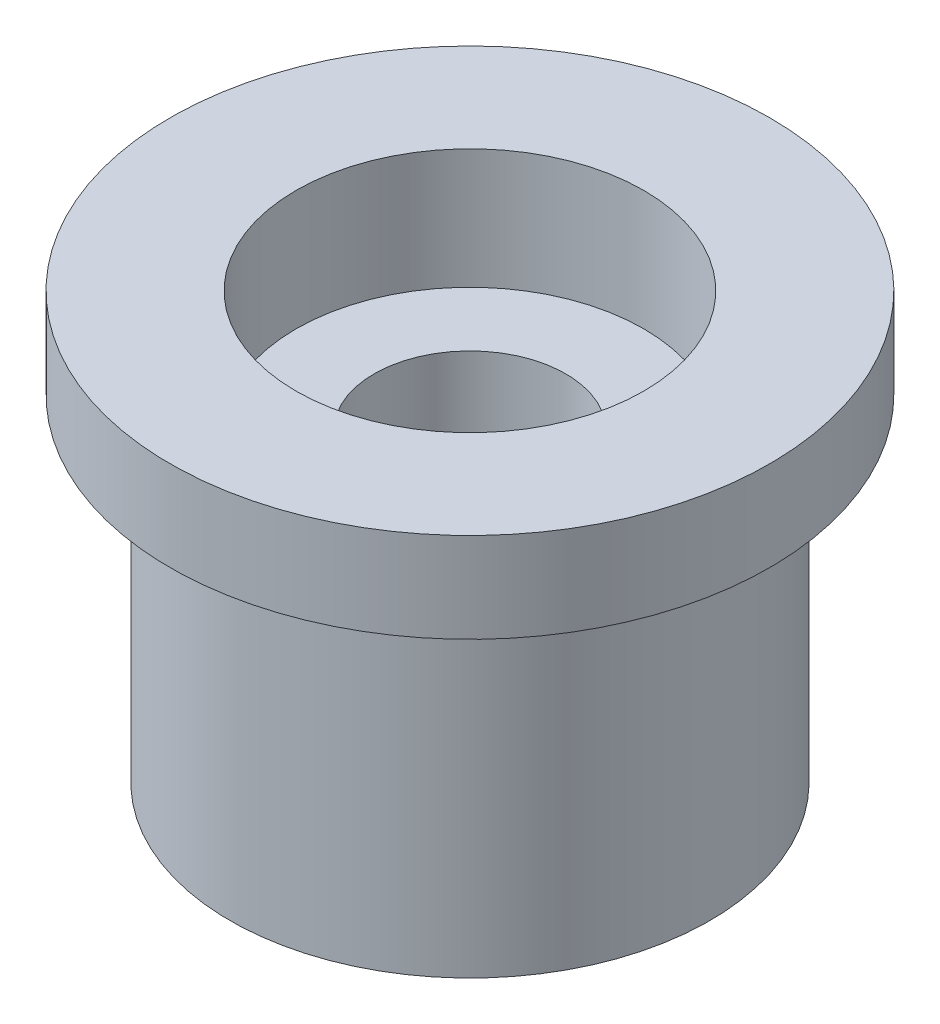
ISO-10303-21;
HEADER;
FILE_DESCRIPTION(('STEP AP214'),'2;1');
FILE_NAME('part.step','',(''),(''),'','','');
FILE_SCHEMA(('AUTOMOTIVE_DESIGN { 1 0 10303 214 1 1 1 1 }'));
ENDSEC;
DATA;
#1=APPLICATION_CONTEXT('core data for automotive mechanical design processes');
#2=APPLICATION_PROTOCOL_DEFINITION('international standard','automotive_design',2000,#1);
#3=PRODUCT_CONTEXT('',#1,'mechanical');
#4=PRODUCT('Part','Part','',(#3));
#5=PRODUCT_RELATED_PRODUCT_CATEGORY('part','',(#4));
#6=PRODUCT_DEFINITION_FORMATION('','',#4);
#7=PRODUCT_DEFINITION_CONTEXT('part definition',#1,'design');
#8=PRODUCT_DEFINITION('design','',#6,#7);
#9=PRODUCT_DEFINITION_SHAPE('','',#8);
#10=(LENGTH_UNIT() NAMED_UNIT(*) SI_UNIT(.MILLI.,.METRE.));
#11=(NAMED_UNIT(*) PLANE_ANGLE_UNIT() SI_UNIT($,.RADIAN.));
#12=(NAMED_UNIT(*) SI_UNIT($,.STERADIAN.) SOLID_ANGLE_UNIT());
#13=UNCERTAINTY_MEASURE_WITH_UNIT(LENGTH_MEASURE(1.E-05),#10,'distance_accuracy_value','');
#14=(GEOMETRIC_REPRESENTATION_CONTEXT(3) GLOBAL_UNCERTAINTY_ASSIGNED_CONTEXT((#13)) GLOBAL_UNIT_ASSIGNED_CONTEXT((#10,
#11,#12)) REPRESENTATION_CONTEXT('',''));
#15=CARTESIAN_POINT('',(0.,0.,0.));
#16=DIRECTION('',(0.,0.,1.));
#17=DIRECTION('',(1.,0.,0.));
#18=AXIS2_PLACEMENT_3D('',#15,#16,#17);
#19=CARTESIAN_POINT('',(0.,7.1,0.));
#20=DIRECTION('',(0.,-1.,0.));
#21=DIRECTION('',(0.,0.,-1.));
#22=AXIS2_PLACEMENT_3D('',#19,#20,#21);
#23=CYLINDRICAL_SURFACE('',#22,5.);
#24=CARTESIAN_POINT('',(0.,7.1,0.));
#25=DIRECTION('',(0.,-1.,0.));
#26=DIRECTION('',(0.,0.,-1.));
#27=AXIS2_PLACEMENT_3D('',#24,#25,#26);
#28=CIRCLE('',#27,5.);
#29=CARTESIAN_POINT('',(0.,7.1,-5.));
#30=VERTEX_POINT('',#29);
#31=EDGE_CURVE('E11',#30,#30,#28,.T.);
#32=ORIENTED_EDGE('',*,*,#31,.T.);
#33=EDGE_LOOP('',(#32));
#34=FACE_BOUND('',#33,.T.);
#35=CARTESIAN_POINT('',(0.,5.6,0.));
#36=DIRECTION('',(0.,-1.,0.));
#37=DIRECTION('',(0.,0.,-1.));
#38=AXIS2_PLACEMENT_3D('',#35,#36,#37);
#39=CIRCLE('',#38,5.);
#40=CARTESIAN_POINT('',(0.,5.6,-5.));
#41=VERTEX_POINT('',#40);
#42=EDGE_CURVE('E40',#41,#41,#39,.T.);
#43=ORIENTED_EDGE('',*,*,#42,.F.);
#44=EDGE_LOOP('',(#43));
#45=FACE_BOUND('',#44,.T.);
#46=ADVANCED_FACE('F33',(#34,#45),#23,.T.);
#47=CARTESIAN_POINT('',(5.,7.1,0.));
#48=DIRECTION('',(0.,1.,0.));
#49=DIRECTION('',(0.,0.,1.));
#50=AXIS2_PLACEMENT_3D('',#47,#48,#49);
#51=PLANE('',#50);
#52=CARTESIAN_POINT('',(0.,7.1,0.));
#53=DIRECTION('',(0.,1.,0.));
#54=DIRECTION('',(0.,0.,1.));
#55=AXIS2_PLACEMENT_3D('',#52,#53,#54);
#56=CIRCLE('',#55,2.9);
#57=CARTESIAN_POINT('',(0.,7.1,2.9));
#58=VERTEX_POINT('',#57);
#59=EDGE_CURVE('E329',#58,#58,#56,.T.);
#60=ORIENTED_EDGE('',*,*,#59,.F.);
#61=EDGE_LOOP('',(#60));
#62=FACE_BOUND('',#61,.T.);
#63=ORIENTED_EDGE('',*,*,#31,.F.);
#64=EDGE_LOOP('',(#63));
#65=FACE_BOUND('',#64,.T.);
#66=ADVANCED_FACE('F235',(#62,#65),#51,.T.);
#67=CARTESIAN_POINT('',(0.,5.6,0.));
#68=DIRECTION('',(0.,-1.,0.));
#69=DIRECTION('',(0.,0.,-1.));
#70=AXIS2_PLACEMENT_3D('',#67,#68,#69);
#71=PLANE('',#70);
#72=CARTESIAN_POINT('',(0.,5.6,0.));
#73=DIRECTION('',(0.,-1.,0.));
#74=DIRECTION('',(0.,0.,-1.));
#75=AXIS2_PLACEMENT_3D('',#72,#73,#74);
#76=CIRCLE('',#75,4.);
#77=CARTESIAN_POINT('',(0.,5.6,-4.));
#78=VERTEX_POINT('',#77);
#79=EDGE_CURVE('E218',#78,#78,#76,.T.);
#80=ORIENTED_EDGE('',*,*,#79,.F.);
#81=EDGE_LOOP('',(#80));
#82=FACE_BOUND('',#81,.T.);
#83=ORIENTED_EDGE('',*,*,#42,.T.);
#84=EDGE_LOOP('',(#83));
#85=FACE_BOUND('',#84,.T.);
#86=ADVANCED_FACE('F232',(#82,#85),#71,.T.);
#87=CARTESIAN_POINT('',(0.,0.,0.));
#88=DIRECTION('',(0.,1.,0.));
#89=DIRECTION('',(0.,0.,1.));
#90=AXIS2_PLACEMENT_3D('',#87,#88,#89);
#91=CYLINDRICAL_SURFACE('',#90,4.);
#92=CARTESIAN_POINT('',(0.,0.,0.));
#93=DIRECTION('',(0.,-1.,0.));
#94=DIRECTION('',(0.,0.,-1.));
#95=AXIS2_PLACEMENT_3D('',#92,#93,#94);
#96=CIRCLE('',#95,4.);
#97=CARTESIAN_POINT('',(0.,0.,-4.));
#98=VERTEX_POINT('',#97);
#99=EDGE_CURVE('E225',#98,#98,#96,.T.);
#100=ORIENTED_EDGE('',*,*,#99,.F.);
#101=EDGE_LOOP('',(#100));
#102=FACE_BOUND('',#101,.T.);
#103=ORIENTED_EDGE('',*,*,#79,.T.);
#104=EDGE_LOOP('',(#103));
#105=FACE_BOUND('',#104,.T.);
#106=ADVANCED_FACE('F246',(#102,#105),#91,.T.);
#107=CARTESIAN_POINT('',(0.,0.,0.));
#108=DIRECTION('',(0.,-1.,0.));
#109=DIRECTION('',(0.,0.,-1.));
#110=AXIS2_PLACEMENT_3D('',#107,#108,#109);
#111=PLANE('',#110);
#112=CARTESIAN_POINT('',(0.,0.,0.));
#113=DIRECTION('',(0.,1.,0.));
#114=DIRECTION('',(0.,0.,1.));
#115=AXIS2_PLACEMENT_3D('',#112,#113,#114);
#116=CIRCLE('',#115,1.60000000000001);
#117=CARTESIAN_POINT('',(0.,0.,1.60000000000001));
#118=VERTEX_POINT('',#117);
#119=EDGE_CURVE('E147',#118,#118,#116,.T.);
#120=ORIENTED_EDGE('',*,*,#119,.T.);
#121=EDGE_LOOP('',(#120));
#122=FACE_BOUND('',#121,.T.);
#123=CARTESIAN_POINT('',(-1.02515075142256E-13,0.,0.));
#124=DIRECTION('',(0.,-1.,0.));
#125=DIRECTION('',(0.,0.,-1.));
#126=AXIS2_PLACEMENT_3D('',#123,#124,#125);
#127=CIRCLE('',#126,3.09999999999998);
#128=CARTESIAN_POINT('',(-1.88345277640779,0.,2.46223590239489));
#129=VERTEX_POINT('',#128);
#130=CARTESIAN_POINT('',(-1.88345277640771,0.,-2.46223590239483));
#131=VERTEX_POINT('',#130);
#132=EDGE_CURVE('E47',#129,#131,#127,.T.);
#133=ORIENTED_EDGE('',*,*,#132,.F.);
#134=DIRECTION('',(-0.500000000000124,0.,0.866025403784367));
#135=VECTOR('',#134,1.);
#136=CARTESIAN_POINT('',(-1.47888532680438,0.,1.76150452459345));
#137=LINE('',#136,#135);
#138=CARTESIAN_POINT('',(-1.47888532680438,0.,1.76150452459345));
#139=VERTEX_POINT('',#138);
#140=EDGE_CURVE('E141',#139,#129,#137,.T.);
#141=ORIENTED_EDGE('',*,*,#140,.F.);
#142=CARTESIAN_POINT('',(-1.02515075142256E-13,0.,0.));
#143=DIRECTION('',(0.,1.,0.));
#144=DIRECTION('',(0.,0.,1.));
#145=AXIS2_PLACEMENT_3D('',#142,#143,#144);
#146=CIRCLE('',#145,2.3);
#147=CARTESIAN_POINT('',(-1.4788853268044,0.,-1.76150452459332));
#148=VERTEX_POINT('',#147);
#149=EDGE_CURVE('E144',#148,#139,#146,.T.);
#150=ORIENTED_EDGE('',*,*,#149,.F.);
#151=DIRECTION('',(0.5,0.,0.866025403784439));
#152=VECTOR('',#151,1.);
#153=CARTESIAN_POINT('',(-1.88345277640771,0.,-2.46223590239483));
#154=LINE('',#153,#152);
#155=EDGE_CURVE('E153',#131,#148,#154,.T.);
#156=ORIENTED_EDGE('',*,*,#155,.F.);
#157=EDGE_LOOP('',(#133,#141,#150,#156));
#158=FACE_BOUND('',#157,.T.);
#159=CARTESIAN_POINT('',(0.,0.,0.));
#160=DIRECTION('',(0.,1.,0.));
#161=DIRECTION('',(0.,0.,1.));
#162=AXIS2_PLACEMENT_3D('',#159,#160,#161);
#163=CIRCLE('',#162,2.3);
#164=CARTESIAN_POINT('',(2.26495033058122,0.,-0.400000000000019));
#165=VERTEX_POINT('',#164);
#166=CARTESIAN_POINT('',(-0.786065003776926,0.,-2.16150452459327));
#167=VERTEX_POINT('',#166);
#168=EDGE_CURVE('E55',#165,#167,#163,.T.);
#169=ORIENTED_EDGE('',*,*,#168,.F.);
#170=DIRECTION('',(-1.,0.,0.));
#171=VECTOR('',#170,1.);
#172=CARTESIAN_POINT('',(3.07408522978788,0.,-0.399999999999992));
#173=LINE('',#172,#171);
#174=CARTESIAN_POINT('',(3.07408522978788,0.,-0.399999999999993));
#175=VERTEX_POINT('',#174);
#176=EDGE_CURVE('E166',#175,#165,#173,.T.);
#177=ORIENTED_EDGE('',*,*,#176,.F.);
#178=CARTESIAN_POINT('',(0.,0.,0.));
#179=DIRECTION('',(0.,-1.,0.));
#180=DIRECTION('',(0.,0.,-1.));
#181=AXIS2_PLACEMENT_3D('',#178,#179,#180);
#182=CIRCLE('',#181,3.1);
#183=CARTESIAN_POINT('',(-1.19063245338013,0.,-2.86223590239484));
#184=VERTEX_POINT('',#183);
#185=EDGE_CURVE('E180',#184,#175,#182,.T.);
#186=ORIENTED_EDGE('',*,*,#185,.F.);
#187=DIRECTION('',(-0.499999999999857,0.,-0.866025403784521));
#188=VECTOR('',#187,1.);
#189=CARTESIAN_POINT('',(-0.786065003776927,0.,-2.16150452459327));
#190=LINE('',#189,#188);
#191=EDGE_CURVE('E177',#167,#184,#190,.T.);
#192=ORIENTED_EDGE('',*,*,#191,.F.);
#193=EDGE_LOOP('',(#169,#177,#186,#192));
#194=FACE_BOUND('',#193,.T.);
#195=CARTESIAN_POINT('',(0.,0.,0.));
#196=DIRECTION('',(0.,-1.,0.));
#197=DIRECTION('',(0.,0.,-1.));
#198=AXIS2_PLACEMENT_3D('',#195,#196,#197);
#199=CIRCLE('',#198,3.1);
#200=CARTESIAN_POINT('',(3.07408522978788,0.,0.399999999999992));
#201=VERTEX_POINT('',#200);
#202=CARTESIAN_POINT('',(-1.19063245337983,0.,2.86223590239497));
#203=VERTEX_POINT('',#202);
#204=EDGE_CURVE('E187',#201,#203,#199,.T.);
#205=ORIENTED_EDGE('',*,*,#204,.F.);
#206=DIRECTION('',(1.,0.,0.));
#207=VECTOR('',#206,1.);
#208=CARTESIAN_POINT('',(2.26495033058122,0.,0.400000000000019));
#209=LINE('',#208,#207);
#210=CARTESIAN_POINT('',(2.26495033058122,0.,0.40000000000002));
#211=VERTEX_POINT('',#210);
#212=EDGE_CURVE('E197',#211,#201,#209,.T.);
#213=ORIENTED_EDGE('',*,*,#212,.F.);
#214=CARTESIAN_POINT('',(0.,0.,0.));
#215=DIRECTION('',(0.,1.,0.));
#216=DIRECTION('',(0.,0.,1.));
#217=AXIS2_PLACEMENT_3D('',#214,#215,#216);
#218=CIRCLE('',#217,2.3);
#219=CARTESIAN_POINT('',(-0.786065003776618,0.,2.16150452459338));
#220=VERTEX_POINT('',#219);
#221=EDGE_CURVE('E211',#220,#211,#218,.T.);
#222=ORIENTED_EDGE('',*,*,#221,.F.);
#223=DIRECTION('',(0.499999999999856,0.,-0.866025403784522));
#224=VECTOR('',#223,1.);
#225=CARTESIAN_POINT('',(-1.19063245337983,0.,2.86223590239497));
#226=LINE('',#225,#224);
#227=EDGE_CURVE('E208',#203,#220,#226,.T.);
#228=ORIENTED_EDGE('',*,*,#227,.F.);
#229=EDGE_LOOP('',(#205,#213,#222,#228));
#230=FACE_BOUND('',#229,.T.);
#231=ORIENTED_EDGE('',*,*,#99,.T.);
#232=EDGE_LOOP('',(#231));
#233=FACE_BOUND('',#232,.T.);
#234=ADVANCED_FACE('F253',(#122,#158,#194,#230,#233),#111,.T.);
#235=CARTESIAN_POINT('',(0.,4.3,0.));
#236=DIRECTION('',(0.,-1.,0.));
#237=DIRECTION('',(0.,0.,-1.));
#238=AXIS2_PLACEMENT_3D('',#235,#236,#237);
#239=CYLINDRICAL_SURFACE('',#238,3.1);
#240=ORIENTED_EDGE('',*,*,#204,.T.);
#241=DIRECTION('',(0.,-1.,0.));
#242=VECTOR('',#241,1.);
#243=CARTESIAN_POINT('',(-1.19063245337983,4.3,2.86223590239497));
#244=LINE('',#243,#242);
#245=CARTESIAN_POINT('',(-1.19063245337983,4.3,2.86223590239497));
#246=VERTEX_POINT('',#245);
#247=EDGE_CURVE('E206',#246,#203,#244,.T.);
#248=ORIENTED_EDGE('',*,*,#247,.F.);
#249=CARTESIAN_POINT('',(0.,4.3,0.));
#250=DIRECTION('',(0.,-1.,0.));
#251=DIRECTION('',(0.,0.,-1.));
#252=AXIS2_PLACEMENT_3D('',#249,#250,#251);
#253=CIRCLE('',#252,3.1);
#254=CARTESIAN_POINT('',(3.07408522978788,4.3,0.399999999999992));
#255=VERTEX_POINT('',#254);
#256=EDGE_CURVE('E193',#255,#246,#253,.T.);
#257=ORIENTED_EDGE('',*,*,#256,.F.);
#258=DIRECTION('',(0.,-1.,0.));
#259=VECTOR('',#258,1.);
#260=CARTESIAN_POINT('',(3.07408522978788,4.3,0.399999999999992));
#261=LINE('',#260,#259);
#262=EDGE_CURVE('E216',#255,#201,#261,.T.);
#263=ORIENTED_EDGE('',*,*,#262,.T.);
#264=EDGE_LOOP('',(#240,#248,#257,#263));
#265=FACE_BOUND('',#264,.T.);
#266=ADVANCED_FACE('F257',(#265),#239,.F.);
#267=CARTESIAN_POINT('',(2.26495033058122,4.3,0.400000000000019));
#268=DIRECTION('',(0.,0.,-1.));
#269=DIRECTION('',(-1.,0.,0.));
#270=AXIS2_PLACEMENT_3D('',#267,#268,#269);
#271=PLANE('',#270);
#272=ORIENTED_EDGE('',*,*,#212,.T.);
#273=ORIENTED_EDGE('',*,*,#262,.F.);
#274=DIRECTION('',(1.,0.,0.));
#275=VECTOR('',#274,1.);
#276=CARTESIAN_POINT('',(2.26495033058122,4.3,0.400000000000019));
#277=LINE('',#276,#275);
#278=CARTESIAN_POINT('',(2.26495033058122,4.3,0.40000000000002));
#279=VERTEX_POINT('',#278);
#280=EDGE_CURVE('E203',#279,#255,#277,.T.);
#281=ORIENTED_EDGE('',*,*,#280,.F.);
#282=DIRECTION('',(0.,-1.,0.));
#283=VECTOR('',#282,1.);
#284=CARTESIAN_POINT('',(2.26495033058122,4.3,0.40000000000002));
#285=LINE('',#284,#283);
#286=EDGE_CURVE('E219',#279,#211,#285,.T.);
#287=ORIENTED_EDGE('',*,*,#286,.T.);
#288=EDGE_LOOP('',(#272,#273,#281,#287));
#289=FACE_BOUND('',#288,.T.);
#290=ADVANCED_FACE('F261',(#289),#271,.F.);
#291=CARTESIAN_POINT('',(0.,4.3,0.));
#292=DIRECTION('',(0.,-1.,0.));
#293=DIRECTION('',(0.,0.,-1.));
#294=AXIS2_PLACEMENT_3D('',#291,#292,#293);
#295=CYLINDRICAL_SURFACE('',#294,2.3);
#296=ORIENTED_EDGE('',*,*,#221,.T.);
#297=ORIENTED_EDGE('',*,*,#286,.F.);
#298=CARTESIAN_POINT('',(0.,4.3,0.));
#299=DIRECTION('',(0.,1.,0.));
#300=DIRECTION('',(0.,0.,1.));
#301=AXIS2_PLACEMENT_3D('',#298,#299,#300);
#302=CIRCLE('',#301,2.3);
#303=CARTESIAN_POINT('',(-0.786065003776618,4.3,2.16150452459338));
#304=VERTEX_POINT('',#303);
#305=EDGE_CURVE('E200',#304,#279,#302,.T.);
#306=ORIENTED_EDGE('',*,*,#305,.F.);
#307=DIRECTION('',(0.,-1.,0.));
#308=VECTOR('',#307,1.);
#309=CARTESIAN_POINT('',(-0.786065003776618,4.3,2.16150452459338));
#310=LINE('',#309,#308);
#311=EDGE_CURVE('E221',#304,#220,#310,.T.);
#312=ORIENTED_EDGE('',*,*,#311,.T.);
#313=EDGE_LOOP('',(#296,#297,#306,#312));
#314=FACE_BOUND('',#313,.T.);
#315=ADVANCED_FACE('F267',(#314),#295,.T.);
#316=CARTESIAN_POINT('',(-1.19063245337983,4.3,2.86223590239497));
#317=DIRECTION('',(-0.866025403784522,0.,-0.499999999999856));
#318=DIRECTION('',(-0.499999999999856,0.,0.866025403784522));
#319=AXIS2_PLACEMENT_3D('',#316,#317,#318);
#320=PLANE('',#319);
#321=ORIENTED_EDGE('',*,*,#227,.T.);
#322=ORIENTED_EDGE('',*,*,#311,.F.);
#323=DIRECTION('',(0.499999999999856,0.,-0.866025403784522));
#324=VECTOR('',#323,1.);
#325=CARTESIAN_POINT('',(-1.19063245337983,4.3,2.86223590239497));
#326=LINE('',#325,#324);
#327=EDGE_CURVE('E196',#246,#304,#326,.T.);
#328=ORIENTED_EDGE('',*,*,#327,.F.);
#329=ORIENTED_EDGE('',*,*,#247,.T.);
#330=EDGE_LOOP('',(#321,#322,#328,#329));
#331=FACE_BOUND('',#330,.T.);
#332=ADVANCED_FACE('F263',(#331),#320,.F.);
#333=CARTESIAN_POINT('',(0.,4.3,0.));
#334=DIRECTION('',(0.,-1.,0.));
#335=DIRECTION('',(0.,0.,-1.));
#336=AXIS2_PLACEMENT_3D('',#333,#334,#335);
#337=PLANE('',#336);
#338=ORIENTED_EDGE('',*,*,#256,.T.);
#339=ORIENTED_EDGE('',*,*,#327,.T.);
#340=ORIENTED_EDGE('',*,*,#305,.T.);
#341=ORIENTED_EDGE('',*,*,#280,.T.);
#342=EDGE_LOOP('',(#338,#339,#340,#341));
#343=FACE_BOUND('',#342,.T.);
#344=ADVANCED_FACE('F266',(#343),#337,.T.);
#345=CARTESIAN_POINT('',(0.,4.3,0.));
#346=DIRECTION('',(0.,-1.,0.));
#347=DIRECTION('',(0.,0.,-1.));
#348=AXIS2_PLACEMENT_3D('',#345,#346,#347);
#349=CYLINDRICAL_SURFACE('',#348,2.3);
#350=ORIENTED_EDGE('',*,*,#168,.T.);
#351=DIRECTION('',(0.,-1.,0.));
#352=VECTOR('',#351,1.);
#353=CARTESIAN_POINT('',(-0.786065003776927,4.3,-2.16150452459327));
#354=LINE('',#353,#352);
#355=CARTESIAN_POINT('',(-0.786065003776927,4.3,-2.16150452459327));
#356=VERTEX_POINT('',#355);
#357=EDGE_CURVE('E175',#356,#167,#354,.T.);
#358=ORIENTED_EDGE('',*,*,#357,.F.);
#359=CARTESIAN_POINT('',(0.,4.3,0.));
#360=DIRECTION('',(0.,1.,0.));
#361=DIRECTION('',(0.,0.,1.));
#362=AXIS2_PLACEMENT_3D('',#359,#360,#361);
#363=CIRCLE('',#362,2.3);
#364=CARTESIAN_POINT('',(2.26495033058122,4.3,-0.400000000000019));
#365=VERTEX_POINT('',#364);
#366=EDGE_CURVE('E162',#365,#356,#363,.T.);
#367=ORIENTED_EDGE('',*,*,#366,.F.);
#368=DIRECTION('',(0.,-1.,0.));
#369=VECTOR('',#368,1.);
#370=CARTESIAN_POINT('',(2.26495033058122,4.3,-0.400000000000019));
#371=LINE('',#370,#369);
#372=EDGE_CURVE('E185',#365,#165,#371,.T.);
#373=ORIENTED_EDGE('',*,*,#372,.T.);
#374=EDGE_LOOP('',(#350,#358,#367,#373));
#375=FACE_BOUND('',#374,.T.);
#376=ADVANCED_FACE('F277',(#375),#349,.T.);
#377=CARTESIAN_POINT('',(3.07408522978788,4.3,-0.399999999999992));
#378=DIRECTION('',(0.,0.,1.));
#379=DIRECTION('',(1.,0.,0.));
#380=AXIS2_PLACEMENT_3D('',#377,#378,#379);
#381=PLANE('',#380);
#382=ORIENTED_EDGE('',*,*,#176,.T.);
#383=ORIENTED_EDGE('',*,*,#372,.F.);
#384=DIRECTION('',(-1.,0.,0.));
#385=VECTOR('',#384,1.);
#386=CARTESIAN_POINT('',(3.07408522978788,4.3,-0.399999999999992));
#387=LINE('',#386,#385);
#388=CARTESIAN_POINT('',(3.07408522978788,4.3,-0.399999999999993));
#389=VERTEX_POINT('',#388);
#390=EDGE_CURVE('E172',#389,#365,#387,.T.);
#391=ORIENTED_EDGE('',*,*,#390,.F.);
#392=DIRECTION('',(0.,-1.,0.));
#393=VECTOR('',#392,1.);
#394=CARTESIAN_POINT('',(3.07408522978788,4.3,-0.399999999999993));
#395=LINE('',#394,#393);
#396=EDGE_CURVE('E188',#389,#175,#395,.T.);
#397=ORIENTED_EDGE('',*,*,#396,.T.);
#398=EDGE_LOOP('',(#382,#383,#391,#397));
#399=FACE_BOUND('',#398,.T.);
#400=ADVANCED_FACE('F281',(#399),#381,.F.);
#401=CARTESIAN_POINT('',(0.,4.3,0.));
#402=DIRECTION('',(0.,-1.,0.));
#403=DIRECTION('',(0.,0.,-1.));
#404=AXIS2_PLACEMENT_3D('',#401,#402,#403);
#405=CYLINDRICAL_SURFACE('',#404,3.1);
#406=ORIENTED_EDGE('',*,*,#185,.T.);
#407=ORIENTED_EDGE('',*,*,#396,.F.);
#408=CARTESIAN_POINT('',(0.,4.3,0.));
#409=DIRECTION('',(0.,-1.,0.));
#410=DIRECTION('',(0.,0.,-1.));
#411=AXIS2_PLACEMENT_3D('',#408,#409,#410);
#412=CIRCLE('',#411,3.1);
#413=CARTESIAN_POINT('',(-1.19063245338013,4.3,-2.86223590239484));
#414=VERTEX_POINT('',#413);
#415=EDGE_CURVE('E169',#414,#389,#412,.T.);
#416=ORIENTED_EDGE('',*,*,#415,.F.);
#417=DIRECTION('',(0.,-1.,0.));
#418=VECTOR('',#417,1.);
#419=CARTESIAN_POINT('',(-1.19063245338013,4.3,-2.86223590239484));
#420=LINE('',#419,#418);
#421=EDGE_CURVE('E190',#414,#184,#420,.T.);
#422=ORIENTED_EDGE('',*,*,#421,.T.);
#423=EDGE_LOOP('',(#406,#407,#416,#422));
#424=FACE_BOUND('',#423,.T.);
#425=ADVANCED_FACE('F286',(#424),#405,.F.);
#426=CARTESIAN_POINT('',(-0.786065003776927,4.3,-2.16150452459327));
#427=DIRECTION('',(-0.866025403784521,0.,0.499999999999857));
#428=DIRECTION('',(0.499999999999857,0.,0.866025403784521));
#429=AXIS2_PLACEMENT_3D('',#426,#427,#428);
#430=PLANE('',#429);
#431=ORIENTED_EDGE('',*,*,#191,.T.);
#432=ORIENTED_EDGE('',*,*,#421,.F.);
#433=DIRECTION('',(-0.499999999999857,0.,-0.866025403784521));
#434=VECTOR('',#433,1.);
#435=CARTESIAN_POINT('',(-0.786065003776927,4.3,-2.16150452459327));
#436=LINE('',#435,#434);
#437=EDGE_CURVE('E165',#356,#414,#436,.T.);
#438=ORIENTED_EDGE('',*,*,#437,.F.);
#439=ORIENTED_EDGE('',*,*,#357,.T.);
#440=EDGE_LOOP('',(#431,#432,#438,#439));
#441=FACE_BOUND('',#440,.T.);
#442=ADVANCED_FACE('F282',(#441),#430,.F.);
#443=CARTESIAN_POINT('',(0.,4.3,0.));
#444=DIRECTION('',(0.,1.,0.));
#445=DIRECTION('',(0.,0.,1.));
#446=AXIS2_PLACEMENT_3D('',#443,#444,#445);
#447=PLANE('',#446);
#448=ORIENTED_EDGE('',*,*,#366,.T.);
#449=ORIENTED_EDGE('',*,*,#437,.T.);
#450=ORIENTED_EDGE('',*,*,#415,.T.);
#451=ORIENTED_EDGE('',*,*,#390,.T.);
#452=EDGE_LOOP('',(#448,#449,#450,#451));
#453=FACE_BOUND('',#452,.T.);
#454=ADVANCED_FACE('F285',(#453),#447,.F.);
#455=CARTESIAN_POINT('',(-1.02515075142256E-13,4.3,0.));
#456=DIRECTION('',(0.,-1.,0.));
#457=DIRECTION('',(0.,0.,-1.));
#458=AXIS2_PLACEMENT_3D('',#455,#456,#457);
#459=CYLINDRICAL_SURFACE('',#458,3.09999999999998);
#460=ORIENTED_EDGE('',*,*,#132,.T.);
#461=DIRECTION('',(0.,-1.,0.));
#462=VECTOR('',#461,1.);
#463=CARTESIAN_POINT('',(-1.88345277640771,4.3,-2.46223590239483));
#464=LINE('',#463,#462);
#465=CARTESIAN_POINT('',(-1.88345277640771,4.3,-2.46223590239483));
#466=VERTEX_POINT('',#465);
#467=EDGE_CURVE('E119',#466,#131,#464,.T.);
#468=ORIENTED_EDGE('',*,*,#467,.F.);
#469=CARTESIAN_POINT('',(-1.02515075142256E-13,4.3,0.));
#470=DIRECTION('',(0.,-1.,0.));
#471=DIRECTION('',(0.,0.,-1.));
#472=AXIS2_PLACEMENT_3D('',#469,#470,#471);
#473=CIRCLE('',#472,3.09999999999998);
#474=CARTESIAN_POINT('',(-1.88345277640779,4.3,2.46223590239489));
#475=VERTEX_POINT('',#474);
#476=EDGE_CURVE('E123',#475,#466,#473,.T.);
#477=ORIENTED_EDGE('',*,*,#476,.F.);
#478=DIRECTION('',(0.,-1.,0.));
#479=VECTOR('',#478,1.);
#480=CARTESIAN_POINT('',(-1.88345277640779,4.3,2.46223590239489));
#481=LINE('',#480,#479);
#482=EDGE_CURVE('E157',#475,#129,#481,.T.);
#483=ORIENTED_EDGE('',*,*,#482,.T.);
#484=EDGE_LOOP('',(#460,#468,#477,#483));
#485=FACE_BOUND('',#484,.T.);
#486=ADVANCED_FACE('F121',(#485),#459,.F.);
#487=CARTESIAN_POINT('',(-1.47888532680438,4.3,1.76150452459345));
#488=DIRECTION('',(0.866025403784367,0.,0.500000000000124));
#489=DIRECTION('',(0.500000000000124,0.,-0.866025403784367));
#490=AXIS2_PLACEMENT_3D('',#487,#488,#489);
#491=PLANE('',#490);
#492=ORIENTED_EDGE('',*,*,#140,.T.);
#493=ORIENTED_EDGE('',*,*,#482,.F.);
#494=DIRECTION('',(-0.500000000000124,0.,0.866025403784367));
#495=VECTOR('',#494,1.);
#496=CARTESIAN_POINT('',(-1.47888532680438,4.3,1.76150452459345));
#497=LINE('',#496,#495);
#498=CARTESIAN_POINT('',(-1.47888532680438,4.3,1.76150452459345));
#499=VERTEX_POINT('',#498);
#500=EDGE_CURVE('E129',#499,#475,#497,.T.);
#501=ORIENTED_EDGE('',*,*,#500,.F.);
#502=DIRECTION('',(0.,-1.,0.));
#503=VECTOR('',#502,1.);
#504=CARTESIAN_POINT('',(-1.47888532680438,4.3,1.76150452459345));
#505=LINE('',#504,#503);
#506=EDGE_CURVE('E159',#499,#139,#505,.T.);
#507=ORIENTED_EDGE('',*,*,#506,.T.);
#508=EDGE_LOOP('',(#492,#493,#501,#507));
#509=FACE_BOUND('',#508,.T.);
#510=ADVANCED_FACE('F299',(#509),#491,.F.);
#511=CARTESIAN_POINT('',(-1.02515075142256E-13,4.3,0.));
#512=DIRECTION('',(0.,-1.,0.));
#513=DIRECTION('',(0.,0.,-1.));
#514=AXIS2_PLACEMENT_3D('',#511,#512,#513);
#515=CYLINDRICAL_SURFACE('',#514,2.3);
#516=ORIENTED_EDGE('',*,*,#149,.T.);
#517=ORIENTED_EDGE('',*,*,#506,.F.);
#518=CARTESIAN_POINT('',(-1.02515075142256E-13,4.3,0.));
#519=DIRECTION('',(0.,1.,0.));
#520=DIRECTION('',(0.,0.,1.));
#521=AXIS2_PLACEMENT_3D('',#518,#519,#520);
#522=CIRCLE('',#521,2.3);
#523=CARTESIAN_POINT('',(-1.4788853268044,4.3,-1.76150452459332));
#524=VERTEX_POINT('',#523);
#525=EDGE_CURVE('E137',#524,#499,#522,.T.);
#526=ORIENTED_EDGE('',*,*,#525,.F.);
#527=DIRECTION('',(0.,-1.,0.));
#528=VECTOR('',#527,1.);
#529=CARTESIAN_POINT('',(-1.4788853268044,4.3,-1.76150452459332));
#530=LINE('',#529,#528);
#531=EDGE_CURVE('E128',#524,#148,#530,.T.);
#532=ORIENTED_EDGE('',*,*,#531,.T.);
#533=EDGE_LOOP('',(#516,#517,#526,#532));
#534=FACE_BOUND('',#533,.T.);
#535=ADVANCED_FACE('F302',(#534),#515,.T.);
#536=CARTESIAN_POINT('',(-1.88345277640771,4.3,-2.46223590239483));
#537=DIRECTION('',(0.866025403784438,0.,-0.5));
#538=DIRECTION('',(-0.5,0.,-0.866025403784439));
#539=AXIS2_PLACEMENT_3D('',#536,#537,#538);
#540=PLANE('',#539);
#541=ORIENTED_EDGE('',*,*,#155,.T.);
#542=ORIENTED_EDGE('',*,*,#531,.F.);
#543=DIRECTION('',(0.5,0.,0.866025403784439));
#544=VECTOR('',#543,1.);
#545=CARTESIAN_POINT('',(-1.88345277640771,4.3,-2.46223590239483));
#546=LINE('',#545,#544);
#547=EDGE_CURVE('E132',#466,#524,#546,.T.);
#548=ORIENTED_EDGE('',*,*,#547,.F.);
#549=ORIENTED_EDGE('',*,*,#467,.T.);
#550=EDGE_LOOP('',(#541,#542,#548,#549));
#551=FACE_BOUND('',#550,.T.);
#552=ADVANCED_FACE('F133',(#551),#540,.F.);
#553=CARTESIAN_POINT('',(-1.02515075142256E-13,4.3,0.));
#554=DIRECTION('',(0.,-1.,0.));
#555=DIRECTION('',(0.,0.,-1.));
#556=AXIS2_PLACEMENT_3D('',#553,#554,#555);
#557=PLANE('',#556);
#558=ORIENTED_EDGE('',*,*,#476,.T.);
#559=ORIENTED_EDGE('',*,*,#547,.T.);
#560=ORIENTED_EDGE('',*,*,#525,.T.);
#561=ORIENTED_EDGE('',*,*,#500,.T.);
#562=EDGE_LOOP('',(#558,#559,#560,#561));
#563=FACE_BOUND('',#562,.T.);
#564=ADVANCED_FACE('F139',(#563),#557,.T.);
#565=CARTESIAN_POINT('',(0.,7.1,0.));
#566=DIRECTION('',(0.,1.,0.));
#567=DIRECTION('',(0.,0.,1.));
#568=AXIS2_PLACEMENT_3D('',#565,#566,#567);
#569=CYLINDRICAL_SURFACE('',#568,1.60000000000001);
#570=ORIENTED_EDGE('',*,*,#119,.F.);
#571=EDGE_LOOP('',(#570));
#572=FACE_BOUND('',#571,.T.);
#573=CARTESIAN_POINT('',(0.,5.1,0.));
#574=DIRECTION('',(0.,1.,0.));
#575=DIRECTION('',(0.,0.,1.));
#576=AXIS2_PLACEMENT_3D('',#573,#574,#575);
#577=CIRCLE('',#576,1.60000000000001);
#578=CARTESIAN_POINT('',(0.,5.1,1.60000000000001));
#579=VERTEX_POINT('',#578);
#580=EDGE_CURVE('E331',#579,#579,#577,.T.);
#581=ORIENTED_EDGE('',*,*,#580,.T.);
#582=EDGE_LOOP('',(#581));
#583=FACE_BOUND('',#582,.T.);
#584=ADVANCED_FACE('F311',(#572,#583),#569,.F.);
#585=CARTESIAN_POINT('',(1.60000000000001,5.1,0.));
#586=DIRECTION('',(0.,-1.,0.));
#587=DIRECTION('',(0.,0.,-1.));
#588=AXIS2_PLACEMENT_3D('',#585,#586,#587);
#589=PLANE('',#588);
#590=ORIENTED_EDGE('',*,*,#580,.F.);
#591=EDGE_LOOP('',(#590));
#592=FACE_BOUND('',#591,.T.);
#593=CARTESIAN_POINT('',(0.,5.1,0.));
#594=DIRECTION('',(0.,1.,0.));
#595=DIRECTION('',(0.,0.,1.));
#596=AXIS2_PLACEMENT_3D('',#593,#594,#595);
#597=CIRCLE('',#596,2.9);
#598=CARTESIAN_POINT('',(0.,5.1,2.9));
#599=VERTEX_POINT('',#598);
#600=EDGE_CURVE('E327',#599,#599,#597,.T.);
#601=ORIENTED_EDGE('',*,*,#600,.T.);
#602=EDGE_LOOP('',(#601));
#603=FACE_BOUND('',#602,.T.);
#604=ADVANCED_FACE('F314',(#592,#603),#589,.F.);
#605=CARTESIAN_POINT('',(0.,7.1,0.));
#606=DIRECTION('',(0.,1.,0.));
#607=DIRECTION('',(0.,0.,1.));
#608=AXIS2_PLACEMENT_3D('',#605,#606,#607);
#609=CYLINDRICAL_SURFACE('',#608,2.9);
#610=ORIENTED_EDGE('',*,*,#600,.F.);
#611=EDGE_LOOP('',(#610));
#612=FACE_BOUND('',#611,.T.);
#613=ORIENTED_EDGE('',*,*,#59,.T.);
#614=EDGE_LOOP('',(#613));
#615=FACE_BOUND('',#614,.T.);
#616=ADVANCED_FACE('F318',(#612,#615),#609,.F.);
#617=CLOSED_SHELL('',(#46,#66,#86,#106,#234,#266,#290,#315,#332,#344,#376,#400,#425,#442,#454,
#486,#510,#535,#552,#564,#584,#604,#616));
#618=MANIFOLD_SOLID_BREP('B2',#617);
#619=ADVANCED_BREP_SHAPE_REPRESENTATION('',(#18,#618),#14);
#620=SHAPE_DEFINITION_REPRESENTATION(#9,#619);
ENDSEC;
END-ISO-10303-21;
